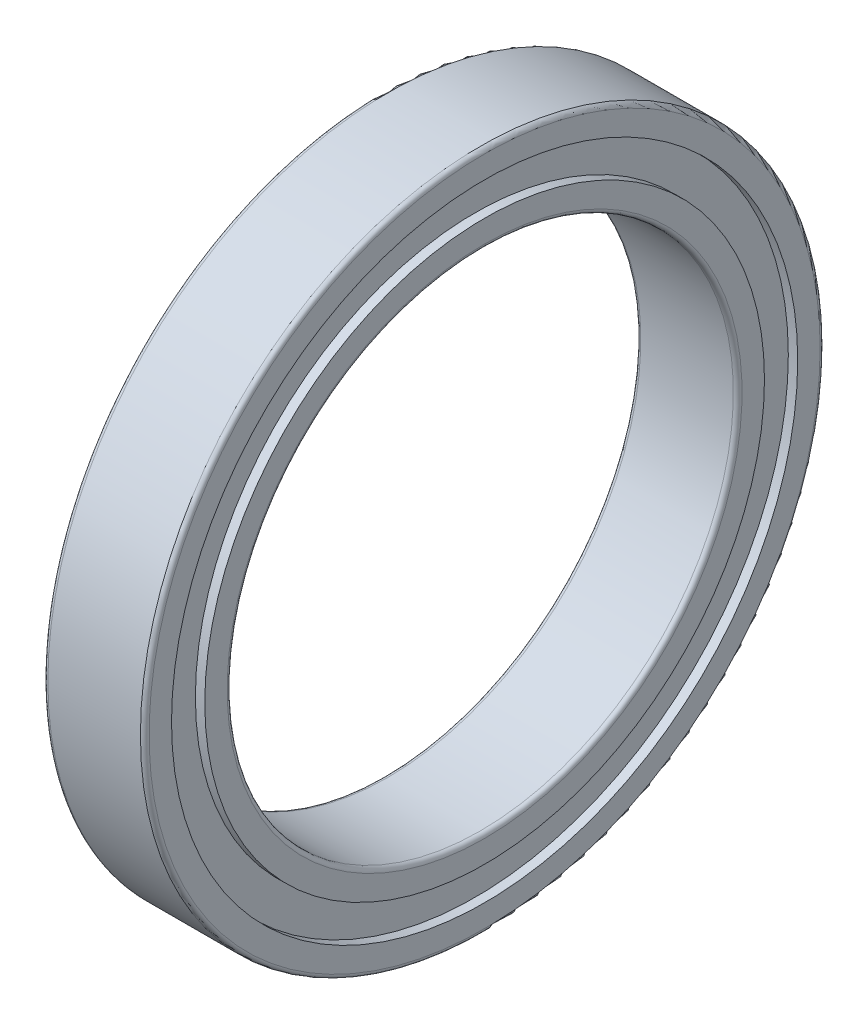
ISO-10303-21;
HEADER;
FILE_DESCRIPTION(('STEP AP214'),'2;1');
FILE_NAME('part.step','',(''),(''),'','','');
FILE_SCHEMA(('AUTOMOTIVE_DESIGN { 1 0 10303 214 1 1 1 1 }'));
ENDSEC;
DATA;
#1=APPLICATION_CONTEXT('core data for automotive mechanical design processes');
#2=APPLICATION_PROTOCOL_DEFINITION('international standard','automotive_design',2000,#1);
#3=PRODUCT_CONTEXT('',#1,'mechanical');
#4=PRODUCT('Part','Part','',(#3));
#5=PRODUCT_RELATED_PRODUCT_CATEGORY('part','',(#4));
#6=PRODUCT_DEFINITION_FORMATION('','',#4);
#7=PRODUCT_DEFINITION_CONTEXT('part definition',#1,'design');
#8=PRODUCT_DEFINITION('design','',#6,#7);
#9=PRODUCT_DEFINITION_SHAPE('','',#8);
#10=(LENGTH_UNIT() NAMED_UNIT(*) SI_UNIT(.MILLI.,.METRE.));
#11=(NAMED_UNIT(*) PLANE_ANGLE_UNIT() SI_UNIT($,.RADIAN.));
#12=(NAMED_UNIT(*) SI_UNIT($,.STERADIAN.) SOLID_ANGLE_UNIT());
#13=UNCERTAINTY_MEASURE_WITH_UNIT(LENGTH_MEASURE(1.E-05),#10,'distance_accuracy_value','');
#14=(GEOMETRIC_REPRESENTATION_CONTEXT(3) GLOBAL_UNCERTAINTY_ASSIGNED_CONTEXT((#13)) GLOBAL_UNIT_ASSIGNED_CONTEXT((#10,
#11,#12)) REPRESENTATION_CONTEXT('',''));
#15=CARTESIAN_POINT('',(0.,0.,0.));
#16=DIRECTION('',(0.,0.,1.));
#17=DIRECTION('',(1.,0.,0.));
#18=AXIS2_PLACEMENT_3D('',#15,#16,#17);
#19=CARTESIAN_POINT('',(-3.2,0.,0.));
#20=DIRECTION('',(1.,0.,0.));
#21=DIRECTION('',(0.,0.,-1.));
#22=AXIS2_PLACEMENT_3D('',#19,#20,#21);
#23=TOROIDAL_SURFACE('',#22,23.2,0.3);
#24=CARTESIAN_POINT('',(-3.5,0.,0.));
#25=DIRECTION('',(1.,0.,0.));
#26=DIRECTION('',(0.,0.,-1.));
#27=AXIS2_PLACEMENT_3D('',#24,#25,#26);
#28=CIRCLE('',#27,23.2);
#29=CARTESIAN_POINT('',(-3.5,0.,-23.2));
#30=VERTEX_POINT('',#29);
#31=EDGE_CURVE('E9',#30,#30,#28,.T.);
#32=ORIENTED_EDGE('',*,*,#31,.T.);
#33=EDGE_LOOP('',(#32));
#34=FACE_BOUND('',#33,.T.);
#35=CARTESIAN_POINT('',(-3.2,0.,0.));
#36=DIRECTION('',(1.,0.,0.));
#37=DIRECTION('',(0.,0.,-1.));
#38=AXIS2_PLACEMENT_3D('',#35,#36,#37);
#39=CIRCLE('',#38,23.5);
#40=CARTESIAN_POINT('',(-3.2,0.,-23.5));
#41=VERTEX_POINT('',#40);
#42=EDGE_CURVE('E136',#41,#41,#39,.T.);
#43=ORIENTED_EDGE('',*,*,#42,.F.);
#44=EDGE_LOOP('',(#43));
#45=FACE_BOUND('',#44,.T.);
#46=ADVANCED_FACE('F14',(#34,#45),#23,.T.);
#47=CARTESIAN_POINT('',(-3.5,21.65,0.));
#48=DIRECTION('',(1.,0.,0.));
#49=DIRECTION('',(0.,1.,0.));
#50=AXIS2_PLACEMENT_3D('',#47,#48,#49);
#51=PLANE('',#50);
#52=CARTESIAN_POINT('',(-3.5,0.,0.));
#53=DIRECTION('',(1.,0.,0.));
#54=DIRECTION('',(0.,0.,-1.));
#55=AXIS2_PLACEMENT_3D('',#52,#53,#54);
#56=CIRCLE('',#55,21.65);
#57=CARTESIAN_POINT('',(-3.5,0.,-21.65));
#58=VERTEX_POINT('',#57);
#59=EDGE_CURVE('E25',#58,#58,#56,.T.);
#60=ORIENTED_EDGE('',*,*,#59,.T.);
#61=EDGE_LOOP('',(#60));
#62=FACE_BOUND('',#61,.T.);
#63=ORIENTED_EDGE('',*,*,#31,.F.);
#64=EDGE_LOOP('',(#63));
#65=FACE_BOUND('',#64,.T.);
#66=ADVANCED_FACE('F173',(#62,#65),#51,.F.);
#67=CARTESIAN_POINT('',(3.5,0.,0.));
#68=DIRECTION('',(-1.,0.,0.));
#69=DIRECTION('',(0.,0.,-1.));
#70=AXIS2_PLACEMENT_3D('',#67,#68,#69);
#71=CYLINDRICAL_SURFACE('',#70,21.65);
#72=ORIENTED_EDGE('',*,*,#59,.F.);
#73=EDGE_LOOP('',(#72));
#74=FACE_BOUND('',#73,.T.);
#75=CARTESIAN_POINT('',(-2.85,0.,0.));
#76=DIRECTION('',(1.,0.,0.));
#77=DIRECTION('',(0.,0.,-1.));
#78=AXIS2_PLACEMENT_3D('',#75,#76,#77);
#79=CIRCLE('',#78,21.65);
#80=CARTESIAN_POINT('',(-2.85,0.,-21.65));
#81=VERTEX_POINT('',#80);
#82=EDGE_CURVE('E122',#81,#81,#79,.T.);
#83=ORIENTED_EDGE('',*,*,#82,.T.);
#84=EDGE_LOOP('',(#83));
#85=FACE_BOUND('',#84,.T.);
#86=ADVANCED_FACE('F16',(#74,#85),#71,.F.);
#87=CARTESIAN_POINT('',(-2.85,19.35,0.));
#88=DIRECTION('',(1.,0.,0.));
#89=DIRECTION('',(0.,1.,0.));
#90=AXIS2_PLACEMENT_3D('',#87,#88,#89);
#91=PLANE('',#90);
#92=CARTESIAN_POINT('',(-2.85,0.,0.));
#93=DIRECTION('',(1.,0.,0.));
#94=DIRECTION('',(0.,0.,-1.));
#95=AXIS2_PLACEMENT_3D('',#92,#93,#94);
#96=CIRCLE('',#95,19.35);
#97=CARTESIAN_POINT('',(-2.85,0.,-19.35));
#98=VERTEX_POINT('',#97);
#99=EDGE_CURVE('E53',#98,#98,#96,.T.);
#100=ORIENTED_EDGE('',*,*,#99,.T.);
#101=EDGE_LOOP('',(#100));
#102=FACE_BOUND('',#101,.T.);
#103=ORIENTED_EDGE('',*,*,#82,.F.);
#104=EDGE_LOOP('',(#103));
#105=FACE_BOUND('',#104,.T.);
#106=ADVANCED_FACE('F187',(#102,#105),#91,.F.);
#107=CARTESIAN_POINT('',(3.2,0.,0.));
#108=DIRECTION('',(1.,0.,0.));
#109=DIRECTION('',(0.,1.,0.));
#110=AXIS2_PLACEMENT_3D('',#107,#108,#109);
#111=TOROIDAL_SURFACE('',#110,17.8,0.3);
#112=CARTESIAN_POINT('',(3.5,0.,0.));
#113=DIRECTION('',(1.,0.,0.));
#114=DIRECTION('',(0.,1.,0.));
#115=AXIS2_PLACEMENT_3D('',#112,#113,#114);
#116=CIRCLE('',#115,17.8);
#117=CARTESIAN_POINT('',(3.5,17.8,0.));
#118=VERTEX_POINT('',#117);
#119=EDGE_CURVE('E109',#118,#118,#116,.T.);
#120=ORIENTED_EDGE('',*,*,#119,.T.);
#121=EDGE_LOOP('',(#120));
#122=FACE_BOUND('',#121,.T.);
#123=CARTESIAN_POINT('',(3.2,0.,0.));
#124=DIRECTION('',(1.,0.,0.));
#125=DIRECTION('',(0.,1.,0.));
#126=AXIS2_PLACEMENT_3D('',#123,#124,#125);
#127=CIRCLE('',#126,17.5);
#128=CARTESIAN_POINT('',(3.2,17.5,0.));
#129=VERTEX_POINT('',#128);
#130=EDGE_CURVE('E18',#129,#129,#127,.T.);
#131=ORIENTED_EDGE('',*,*,#130,.F.);
#132=EDGE_LOOP('',(#131));
#133=FACE_BOUND('',#132,.T.);
#134=ADVANCED_FACE('F190',(#122,#133),#111,.T.);
#135=CARTESIAN_POINT('',(50.,0.,0.));
#136=DIRECTION('',(-1.,0.,0.));
#137=DIRECTION('',(0.,1.,0.));
#138=AXIS2_PLACEMENT_3D('',#135,#136,#137);
#139=CYLINDRICAL_SURFACE('',#138,17.5);
#140=ORIENTED_EDGE('',*,*,#130,.T.);
#141=EDGE_LOOP('',(#140));
#142=FACE_BOUND('',#141,.T.);
#143=CARTESIAN_POINT('',(-3.2,0.,0.));
#144=DIRECTION('',(1.,0.,0.));
#145=DIRECTION('',(0.,1.,0.));
#146=AXIS2_PLACEMENT_3D('',#143,#144,#145);
#147=CIRCLE('',#146,17.5);
#148=CARTESIAN_POINT('',(-3.2,17.5,0.));
#149=VERTEX_POINT('',#148);
#150=EDGE_CURVE('E60',#149,#149,#147,.T.);
#151=ORIENTED_EDGE('',*,*,#150,.F.);
#152=EDGE_LOOP('',(#151));
#153=FACE_BOUND('',#152,.T.);
#154=ADVANCED_FACE('F195',(#142,#153),#139,.F.);
#155=CARTESIAN_POINT('',(-3.2,0.,0.));
#156=DIRECTION('',(1.,0.,0.));
#157=DIRECTION('',(0.,1.,0.));
#158=AXIS2_PLACEMENT_3D('',#155,#156,#157);
#159=TOROIDAL_SURFACE('',#158,17.8,0.3);
#160=ORIENTED_EDGE('',*,*,#150,.T.);
#161=EDGE_LOOP('',(#160));
#162=FACE_BOUND('',#161,.T.);
#163=CARTESIAN_POINT('',(-3.5,0.,0.));
#164=DIRECTION('',(1.,0.,0.));
#165=DIRECTION('',(0.,1.,0.));
#166=AXIS2_PLACEMENT_3D('',#163,#164,#165);
#167=CIRCLE('',#166,17.8);
#168=CARTESIAN_POINT('',(-3.5,17.8,0.));
#169=VERTEX_POINT('',#168);
#170=EDGE_CURVE('E119',#169,#169,#167,.T.);
#171=ORIENTED_EDGE('',*,*,#170,.F.);
#172=EDGE_LOOP('',(#171));
#173=FACE_BOUND('',#172,.T.);
#174=ADVANCED_FACE('F167',(#162,#173),#159,.T.);
#175=CARTESIAN_POINT('',(3.5,0.,0.));
#176=DIRECTION('',(-1.,0.,0.));
#177=DIRECTION('',(0.,0.,-1.));
#178=AXIS2_PLACEMENT_3D('',#175,#176,#177);
#179=CYLINDRICAL_SURFACE('',#178,19.35);
#180=ORIENTED_EDGE('',*,*,#99,.F.);
#181=EDGE_LOOP('',(#180));
#182=FACE_BOUND('',#181,.T.);
#183=CARTESIAN_POINT('',(-3.5,0.,0.));
#184=DIRECTION('',(1.,0.,0.));
#185=DIRECTION('',(0.,0.,-1.));
#186=AXIS2_PLACEMENT_3D('',#183,#184,#185);
#187=CIRCLE('',#186,19.35);
#188=CARTESIAN_POINT('',(-3.5,0.,-19.35));
#189=VERTEX_POINT('',#188);
#190=EDGE_CURVE('E120',#189,#189,#187,.T.);
#191=ORIENTED_EDGE('',*,*,#190,.T.);
#192=EDGE_LOOP('',(#191));
#193=FACE_BOUND('',#192,.T.);
#194=ADVANCED_FACE('F151',(#182,#193),#179,.T.);
#195=CARTESIAN_POINT('',(-3.5,0.,0.));
#196=DIRECTION('',(1.,0.,0.));
#197=DIRECTION('',(0.,1.,0.));
#198=AXIS2_PLACEMENT_3D('',#195,#196,#197);
#199=PLANE('',#198);
#200=ORIENTED_EDGE('',*,*,#170,.T.);
#201=EDGE_LOOP('',(#200));
#202=FACE_BOUND('',#201,.T.);
#203=ORIENTED_EDGE('',*,*,#190,.F.);
#204=EDGE_LOOP('',(#203));
#205=FACE_BOUND('',#204,.T.);
#206=ADVANCED_FACE('F153',(#202,#205),#199,.F.);
#207=CARTESIAN_POINT('',(3.5,0.,0.));
#208=DIRECTION('',(-1.,0.,0.));
#209=DIRECTION('',(0.,0.,-1.));
#210=AXIS2_PLACEMENT_3D('',#207,#208,#209);
#211=CYLINDRICAL_SURFACE('',#210,23.5);
#212=CARTESIAN_POINT('',(3.2,0.,0.));
#213=DIRECTION('',(1.,0.,0.));
#214=DIRECTION('',(0.,0.,-1.));
#215=AXIS2_PLACEMENT_3D('',#212,#213,#214);
#216=CIRCLE('',#215,23.5);
#217=CARTESIAN_POINT('',(3.2,0.,-23.5));
#218=VERTEX_POINT('',#217);
#219=EDGE_CURVE('E139',#218,#218,#216,.T.);
#220=ORIENTED_EDGE('',*,*,#219,.F.);
#221=EDGE_LOOP('',(#220));
#222=FACE_BOUND('',#221,.T.);
#223=ORIENTED_EDGE('',*,*,#42,.T.);
#224=EDGE_LOOP('',(#223));
#225=FACE_BOUND('',#224,.T.);
#226=ADVANCED_FACE('F155',(#222,#225),#211,.T.);
#227=CARTESIAN_POINT('',(3.2,0.,0.));
#228=DIRECTION('',(1.,0.,0.));
#229=DIRECTION('',(0.,0.,-1.));
#230=AXIS2_PLACEMENT_3D('',#227,#228,#229);
#231=TOROIDAL_SURFACE('',#230,23.2,0.3);
#232=ORIENTED_EDGE('',*,*,#219,.T.);
#233=EDGE_LOOP('',(#232));
#234=FACE_BOUND('',#233,.T.);
#235=CARTESIAN_POINT('',(3.5,0.,0.));
#236=DIRECTION('',(1.,0.,0.));
#237=DIRECTION('',(0.,0.,-1.));
#238=AXIS2_PLACEMENT_3D('',#235,#236,#237);
#239=CIRCLE('',#238,23.2);
#240=CARTESIAN_POINT('',(3.5,0.,-23.2));
#241=VERTEX_POINT('',#240);
#242=EDGE_CURVE('E135',#241,#241,#239,.T.);
#243=ORIENTED_EDGE('',*,*,#242,.F.);
#244=EDGE_LOOP('',(#243));
#245=FACE_BOUND('',#244,.T.);
#246=ADVANCED_FACE('F164',(#234,#245),#231,.T.);
#247=CARTESIAN_POINT('',(3.5,23.2,0.));
#248=DIRECTION('',(-1.,0.,0.));
#249=DIRECTION('',(0.,0.,1.));
#250=AXIS2_PLACEMENT_3D('',#247,#248,#249);
#251=PLANE('',#250);
#252=CARTESIAN_POINT('',(3.5,0.,0.));
#253=DIRECTION('',(1.,0.,0.));
#254=DIRECTION('',(0.,0.,-1.));
#255=AXIS2_PLACEMENT_3D('',#252,#253,#254);
#256=CIRCLE('',#255,21.65);
#257=CARTESIAN_POINT('',(3.5,0.,-21.65));
#258=VERTEX_POINT('',#257);
#259=EDGE_CURVE('E130',#258,#258,#256,.T.);
#260=ORIENTED_EDGE('',*,*,#259,.F.);
#261=EDGE_LOOP('',(#260));
#262=FACE_BOUND('',#261,.T.);
#263=ORIENTED_EDGE('',*,*,#242,.T.);
#264=EDGE_LOOP('',(#263));
#265=FACE_BOUND('',#264,.T.);
#266=ADVANCED_FACE('F257',(#262,#265),#251,.F.);
#267=CARTESIAN_POINT('',(3.5,0.,0.));
#268=DIRECTION('',(-1.,0.,0.));
#269=DIRECTION('',(0.,0.,-1.));
#270=AXIS2_PLACEMENT_3D('',#267,#268,#269);
#271=CYLINDRICAL_SURFACE('',#270,21.65);
#272=CARTESIAN_POINT('',(2.85,0.,0.));
#273=DIRECTION('',(1.,0.,0.));
#274=DIRECTION('',(0.,0.,-1.));
#275=AXIS2_PLACEMENT_3D('',#272,#273,#274);
#276=CIRCLE('',#275,21.65);
#277=CARTESIAN_POINT('',(2.85,0.,-21.65));
#278=VERTEX_POINT('',#277);
#279=EDGE_CURVE('E126',#278,#278,#276,.T.);
#280=ORIENTED_EDGE('',*,*,#279,.F.);
#281=EDGE_LOOP('',(#280));
#282=FACE_BOUND('',#281,.T.);
#283=ORIENTED_EDGE('',*,*,#259,.T.);
#284=EDGE_LOOP('',(#283));
#285=FACE_BOUND('',#284,.T.);
#286=ADVANCED_FACE('F192',(#282,#285),#271,.F.);
#287=CARTESIAN_POINT('',(2.85,21.65,0.));
#288=DIRECTION('',(-1.,0.,0.));
#289=DIRECTION('',(0.,0.,1.));
#290=AXIS2_PLACEMENT_3D('',#287,#288,#289);
#291=PLANE('',#290);
#292=CARTESIAN_POINT('',(2.85,0.,0.));
#293=DIRECTION('',(1.,0.,0.));
#294=DIRECTION('',(0.,0.,-1.));
#295=AXIS2_PLACEMENT_3D('',#292,#293,#294);
#296=CIRCLE('',#295,19.35);
#297=CARTESIAN_POINT('',(2.85,0.,-19.35));
#298=VERTEX_POINT('',#297);
#299=EDGE_CURVE('E115',#298,#298,#296,.T.);
#300=ORIENTED_EDGE('',*,*,#299,.F.);
#301=EDGE_LOOP('',(#300));
#302=FACE_BOUND('',#301,.T.);
#303=ORIENTED_EDGE('',*,*,#279,.T.);
#304=EDGE_LOOP('',(#303));
#305=FACE_BOUND('',#304,.T.);
#306=ADVANCED_FACE('F186',(#302,#305),#291,.F.);
#307=CARTESIAN_POINT('',(3.5,0.,0.));
#308=DIRECTION('',(-1.,0.,0.));
#309=DIRECTION('',(0.,0.,-1.));
#310=AXIS2_PLACEMENT_3D('',#307,#308,#309);
#311=CYLINDRICAL_SURFACE('',#310,19.35);
#312=CARTESIAN_POINT('',(3.5,0.,0.));
#313=DIRECTION('',(1.,0.,0.));
#314=DIRECTION('',(0.,0.,-1.));
#315=AXIS2_PLACEMENT_3D('',#312,#313,#314);
#316=CIRCLE('',#315,19.35);
#317=CARTESIAN_POINT('',(3.5,0.,-19.35));
#318=VERTEX_POINT('',#317);
#319=EDGE_CURVE('E105',#318,#318,#316,.T.);
#320=ORIENTED_EDGE('',*,*,#319,.F.);
#321=EDGE_LOOP('',(#320));
#322=FACE_BOUND('',#321,.T.);
#323=ORIENTED_EDGE('',*,*,#299,.T.);
#324=EDGE_LOOP('',(#323));
#325=FACE_BOUND('',#324,.T.);
#326=ADVANCED_FACE('F183',(#322,#325),#311,.T.);
#327=CARTESIAN_POINT('',(3.5,19.35,0.));
#328=DIRECTION('',(-1.,0.,0.));
#329=DIRECTION('',(0.,0.,1.));
#330=AXIS2_PLACEMENT_3D('',#327,#328,#329);
#331=PLANE('',#330);
#332=ORIENTED_EDGE('',*,*,#119,.F.);
#333=EDGE_LOOP('',(#332));
#334=FACE_BOUND('',#333,.T.);
#335=ORIENTED_EDGE('',*,*,#319,.T.);
#336=EDGE_LOOP('',(#335));
#337=FACE_BOUND('',#336,.T.);
#338=ADVANCED_FACE('F106',(#334,#337),#331,.F.);
#339=CLOSED_SHELL('',(#46,#66,#86,#106,#134,#154,#174,#194,#206,#226,#246,#266,#286,#306,#326,#338));
#340=MANIFOLD_SOLID_BREP('B1',#339);
#341=ADVANCED_BREP_SHAPE_REPRESENTATION('',(#18,#340),#14);
#342=SHAPE_DEFINITION_REPRESENTATION(#9,#341);
ENDSEC;
END-ISO-10303-21;
